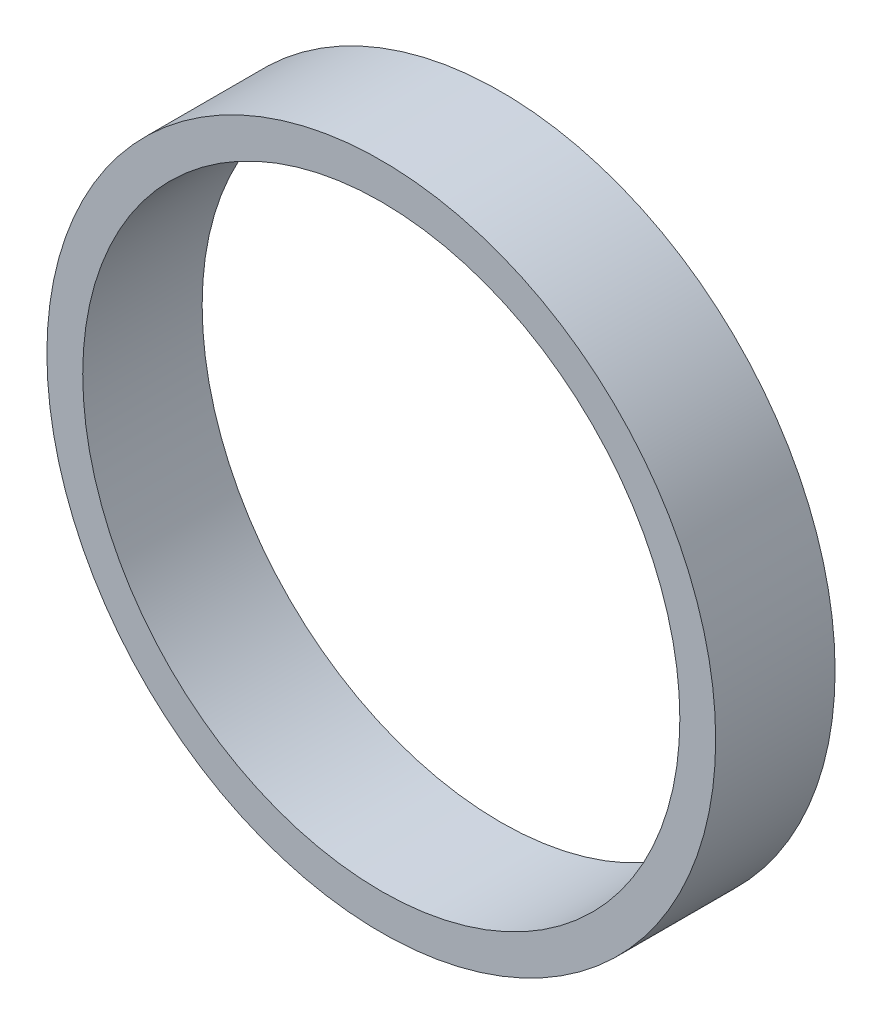
ISO-10303-21;
HEADER;
FILE_DESCRIPTION(('STEP AP214'),'2;1');
FILE_NAME('part.step','',(''),(''),'','','');
FILE_SCHEMA(('AUTOMOTIVE_DESIGN { 1 0 10303 214 1 1 1 1 }'));
ENDSEC;
DATA;
#1=APPLICATION_CONTEXT('core data for automotive mechanical design processes');
#2=APPLICATION_PROTOCOL_DEFINITION('international standard','automotive_design',2000,#1);
#3=PRODUCT_CONTEXT('',#1,'mechanical');
#4=PRODUCT('Part','Part','',(#3));
#5=PRODUCT_RELATED_PRODUCT_CATEGORY('part','',(#4));
#6=PRODUCT_DEFINITION_FORMATION('','',#4);
#7=PRODUCT_DEFINITION_CONTEXT('part definition',#1,'design');
#8=PRODUCT_DEFINITION('design','',#6,#7);
#9=PRODUCT_DEFINITION_SHAPE('','',#8);
#10=(LENGTH_UNIT() NAMED_UNIT(*) SI_UNIT(.MILLI.,.METRE.));
#11=(NAMED_UNIT(*) PLANE_ANGLE_UNIT() SI_UNIT($,.RADIAN.));
#12=(NAMED_UNIT(*) SI_UNIT($,.STERADIAN.) SOLID_ANGLE_UNIT());
#13=UNCERTAINTY_MEASURE_WITH_UNIT(LENGTH_MEASURE(1.E-05),#10,'distance_accuracy_value','');
#14=(GEOMETRIC_REPRESENTATION_CONTEXT(3) GLOBAL_UNCERTAINTY_ASSIGNED_CONTEXT((#13)) GLOBAL_UNIT_ASSIGNED_CONTEXT((#10,
#11,#12)) REPRESENTATION_CONTEXT('',''));
#15=CARTESIAN_POINT('',(0.,0.,0.));
#16=DIRECTION('',(0.,0.,1.));
#17=DIRECTION('',(1.,0.,0.));
#18=AXIS2_PLACEMENT_3D('',#15,#16,#17);
#19=CARTESIAN_POINT('',(0.,0.,9.99999999999999));
#20=DIRECTION('',(0.,0.,1.));
#21=DIRECTION('',(1.,0.,0.));
#22=AXIS2_PLACEMENT_3D('',#19,#20,#21);
#23=PLANE('',#22);
#24=CARTESIAN_POINT('',(0.,0.,9.99999999999999));
#25=DIRECTION('',(0.,0.,1.));
#26=DIRECTION('',(1.,0.,0.));
#27=AXIS2_PLACEMENT_3D('',#24,#25,#26);
#28=CIRCLE('',#27,28.);
#29=CARTESIAN_POINT('',(28.,0.,9.99999999999999));
#30=VERTEX_POINT('',#29);
#31=EDGE_CURVE('E12',#30,#30,#28,.T.);
#32=ORIENTED_EDGE('',*,*,#31,.T.);
#33=EDGE_LOOP('',(#32));
#34=FACE_BOUND('',#33,.T.);
#35=CARTESIAN_POINT('',(0.,0.,9.99999999999999));
#36=DIRECTION('',(0.,0.,1.));
#37=DIRECTION('',(1.,0.,0.));
#38=AXIS2_PLACEMENT_3D('',#35,#36,#37);
#39=CIRCLE('',#38,25.);
#40=CARTESIAN_POINT('',(25.,0.,9.99999999999999));
#41=VERTEX_POINT('',#40);
#42=EDGE_CURVE('E53',#41,#41,#39,.T.);
#43=ORIENTED_EDGE('',*,*,#42,.F.);
#44=EDGE_LOOP('',(#43));
#45=FACE_BOUND('',#44,.T.);
#46=ADVANCED_FACE('F42',(#34,#45),#23,.T.);
#47=CARTESIAN_POINT('',(0.,0.,0.));
#48=DIRECTION('',(0.,0.,1.));
#49=DIRECTION('',(1.,0.,0.));
#50=AXIS2_PLACEMENT_3D('',#47,#48,#49);
#51=PLANE('',#50);
#52=CARTESIAN_POINT('',(0.,0.,0.));
#53=DIRECTION('',(0.,0.,1.));
#54=DIRECTION('',(1.,0.,0.));
#55=AXIS2_PLACEMENT_3D('',#52,#53,#54);
#56=CIRCLE('',#55,28.);
#57=CARTESIAN_POINT('',(28.,0.,0.));
#58=VERTEX_POINT('',#57);
#59=EDGE_CURVE('E46',#58,#58,#56,.T.);
#60=ORIENTED_EDGE('',*,*,#59,.F.);
#61=EDGE_LOOP('',(#60));
#62=FACE_BOUND('',#61,.T.);
#63=CARTESIAN_POINT('',(0.,0.,0.));
#64=DIRECTION('',(0.,0.,1.));
#65=DIRECTION('',(1.,0.,0.));
#66=AXIS2_PLACEMENT_3D('',#63,#64,#65);
#67=CIRCLE('',#66,25.);
#68=CARTESIAN_POINT('',(25.,0.,0.));
#69=VERTEX_POINT('',#68);
#70=EDGE_CURVE('E55',#69,#69,#67,.T.);
#71=ORIENTED_EDGE('',*,*,#70,.T.);
#72=EDGE_LOOP('',(#71));
#73=FACE_BOUND('',#72,.T.);
#74=ADVANCED_FACE('F65',(#62,#73),#51,.F.);
#75=CARTESIAN_POINT('',(0.,0.,9.99999999999999));
#76=DIRECTION('',(0.,0.,-1.));
#77=DIRECTION('',(-1.,0.,0.));
#78=AXIS2_PLACEMENT_3D('',#75,#76,#77);
#79=CYLINDRICAL_SURFACE('',#78,28.);
#80=ORIENTED_EDGE('',*,*,#31,.F.);
#81=EDGE_LOOP('',(#80));
#82=FACE_BOUND('',#81,.T.);
#83=ORIENTED_EDGE('',*,*,#59,.T.);
#84=EDGE_LOOP('',(#83));
#85=FACE_BOUND('',#84,.T.);
#86=ADVANCED_FACE('F44',(#82,#85),#79,.T.);
#87=CARTESIAN_POINT('',(0.,0.,9.99999999999999));
#88=DIRECTION('',(0.,0.,-1.));
#89=DIRECTION('',(-1.,0.,0.));
#90=AXIS2_PLACEMENT_3D('',#87,#88,#89);
#91=CYLINDRICAL_SURFACE('',#90,25.);
#92=ORIENTED_EDGE('',*,*,#42,.T.);
#93=EDGE_LOOP('',(#92));
#94=FACE_BOUND('',#93,.T.);
#95=ORIENTED_EDGE('',*,*,#70,.F.);
#96=EDGE_LOOP('',(#95));
#97=FACE_BOUND('',#96,.T.);
#98=ADVANCED_FACE('F61',(#94,#97),#91,.F.);
#99=CLOSED_SHELL('',(#46,#74,#86,#98));
#100=MANIFOLD_SOLID_BREP('B2',#99);
#101=ADVANCED_BREP_SHAPE_REPRESENTATION('',(#18,#100),#14);
#102=SHAPE_DEFINITION_REPRESENTATION(#9,#101);
ENDSEC;
END-ISO-10303-21;
